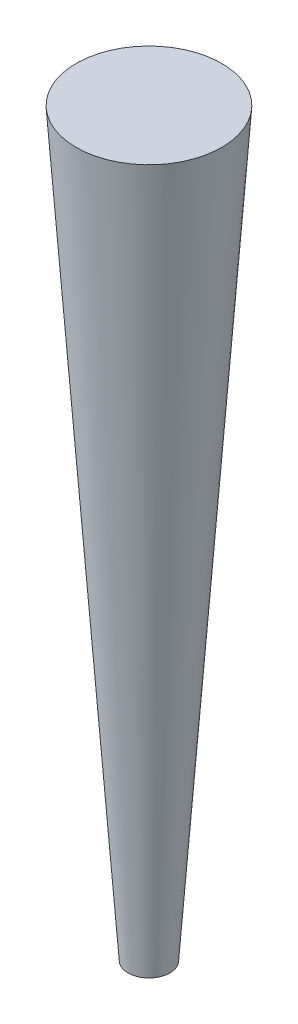
ISO-10303-21;
HEADER;
FILE_DESCRIPTION(('STEP AP214'),'2;1');
FILE_NAME('part.step','',(''),(''),'','','');
FILE_SCHEMA(('AUTOMOTIVE_DESIGN { 1 0 10303 214 1 1 1 1 }'));
ENDSEC;
DATA;
#1=APPLICATION_CONTEXT('core data for automotive mechanical design processes');
#2=APPLICATION_PROTOCOL_DEFINITION('international standard','automotive_design',2000,#1);
#3=PRODUCT_CONTEXT('',#1,'mechanical');
#4=PRODUCT('Part','Part','',(#3));
#5=PRODUCT_RELATED_PRODUCT_CATEGORY('part','',(#4));
#6=PRODUCT_DEFINITION_FORMATION('','',#4);
#7=PRODUCT_DEFINITION_CONTEXT('part definition',#1,'design');
#8=PRODUCT_DEFINITION('design','',#6,#7);
#9=PRODUCT_DEFINITION_SHAPE('','',#8);
#10=(LENGTH_UNIT() NAMED_UNIT(*) SI_UNIT(.MILLI.,.METRE.));
#11=(NAMED_UNIT(*) PLANE_ANGLE_UNIT() SI_UNIT($,.RADIAN.));
#12=(NAMED_UNIT(*) SI_UNIT($,.STERADIAN.) SOLID_ANGLE_UNIT());
#13=UNCERTAINTY_MEASURE_WITH_UNIT(LENGTH_MEASURE(1.E-05),#10,'distance_accuracy_value','');
#14=(GEOMETRIC_REPRESENTATION_CONTEXT(3) GLOBAL_UNCERTAINTY_ASSIGNED_CONTEXT((#13)) GLOBAL_UNIT_ASSIGNED_CONTEXT((#10,
#11,#12)) REPRESENTATION_CONTEXT('',''));
#15=CARTESIAN_POINT('',(0.,0.,0.));
#16=DIRECTION('',(0.,0.,1.));
#17=DIRECTION('',(1.,0.,0.));
#18=AXIS2_PLACEMENT_3D('',#15,#16,#17);
#19=CARTESIAN_POINT('',(0.,300.,0.));
#20=DIRECTION('',(0.,1.,0.));
#21=DIRECTION('',(0.,0.,1.));
#22=AXIS2_PLACEMENT_3D('',#19,#20,#21);
#23=PLANE('',#22);
#24=CARTESIAN_POINT('',(0.,300.,0.));
#25=DIRECTION('',(0.,-1.,0.));
#26=DIRECTION('',(0.,0.,-1.));
#27=AXIS2_PLACEMENT_3D('',#24,#25,#26);
#28=CIRCLE('',#27,28.978043583051);
#29=CARTESIAN_POINT('',(0.,300.,28.978043583051));
#30=VERTEX_POINT('',#29);
#31=EDGE_CURVE('E10',#30,#30,#28,.T.);
#32=ORIENTED_EDGE('',*,*,#31,.F.);
#33=EDGE_LOOP('',(#32));
#34=FACE_BOUND('',#33,.T.);
#35=ADVANCED_FACE('F33',(#34),#23,.T.);
#36=CARTESIAN_POINT('',(0.,0.,0.));
#37=DIRECTION('',(0.,1.,0.));
#38=DIRECTION('',(0.,0.,1.));
#39=AXIS2_PLACEMENT_3D('',#36,#37,#38);
#40=CONICAL_SURFACE('',#39,8.,0.069813170079766);
#41=CARTESIAN_POINT('',(0.,4.97503205442649,0.));
#42=DIRECTION('',(0.,1.,0.));
#43=DIRECTION('',(0.,0.,1.));
#44=AXIS2_PLACEMENT_3D('',#41,#42,#43);
#45=CIRCLE('',#44,8.34788813088278);
#46=CARTESIAN_POINT('',(0.,4.97503205442649,8.34788813088278));
#47=VERTEX_POINT('',#46);
#48=EDGE_CURVE('E36',#47,#47,#45,.F.);
#49=CARTESIAN_POINT('',(0.,4.97503205442649,8.34788813088278));
#50=CARTESIAN_POINT('',(0.,8.04820880385955,8.56278558350953));
#51=CARTESIAN_POINT('',(0.,11.1213855532926,8.77768303613629));
#52=CARTESIAN_POINT('',(0.,17.2677390521587,9.20747794138979));
#53=CARTESIAN_POINT('',(0.,20.3409158015918,9.42237539401654));
#54=CARTESIAN_POINT('',(0.,26.4872693004579,9.85217029927004));
#55=CARTESIAN_POINT('',(0.,29.560446049891,10.0670677518968));
#56=CARTESIAN_POINT('',(0.,35.7067995487571,10.4968626571503));
#57=CARTESIAN_POINT('',(0.,38.7799762981901,10.7117601097771));
#58=CARTESIAN_POINT('',(0.,44.9263297970562,11.1415550150306));
#59=CARTESIAN_POINT('',(0.,47.9995065464893,11.3564524676573));
#60=CARTESIAN_POINT('',(0.,54.1458600453554,11.7862473729108));
#61=CARTESIAN_POINT('',(0.,57.2190367947885,12.0011448255376));
#62=CARTESIAN_POINT('',(0.,63.3653902936546,12.4309397307911));
#63=CARTESIAN_POINT('',(0.,66.4385670430876,12.6458371834178));
#64=CARTESIAN_POINT('',(0.,72.5849205419537,13.0756320886713));
#65=CARTESIAN_POINT('',(0.,75.6580972913868,13.2905295412981));
#66=CARTESIAN_POINT('',(0.,81.8044507902529,13.7203244465516));
#67=CARTESIAN_POINT('',(0.,84.877627539686,13.9352218991783));
#68=CARTESIAN_POINT('',(0.,91.0239810385521,14.3650168044318));
#69=CARTESIAN_POINT('',(0.,94.0971577879852,14.5799142570586));
#70=CARTESIAN_POINT('',(0.,100.243511286851,15.0097091623121));
#71=CARTESIAN_POINT('',(0.,103.316688036284,15.2246066149388));
#72=CARTESIAN_POINT('',(0.,109.46304153515,15.6544015201923));
#73=CARTESIAN_POINT('',(0.,112.536218284583,15.8692989728191));
#74=CARTESIAN_POINT('',(0.,118.68257178345,16.2990938780726));
#75=CARTESIAN_POINT('',(0.,121.755748532883,16.5139913306994));
#76=CARTESIAN_POINT('',(0.,127.902102031749,16.9437862359529));
#77=CARTESIAN_POINT('',(0.,130.975278781182,17.1586836885796));
#78=CARTESIAN_POINT('',(0.,137.121632280048,17.5884785938331));
#79=CARTESIAN_POINT('',(0.,140.194809029481,17.8033760464599));
#80=CARTESIAN_POINT('',(0.,146.341162528347,18.2331709517134));
#81=CARTESIAN_POINT('',(0.,149.41433927778,18.4480684043401));
#82=CARTESIAN_POINT('',(0.,155.560692776646,18.8778633095936));
#83=CARTESIAN_POINT('',(0.,158.633869526079,19.0927607622204));
#84=CARTESIAN_POINT('',(0.,164.780223024945,19.5225556674739));
#85=CARTESIAN_POINT('',(0.,167.853399774379,19.7374531201006));
#86=CARTESIAN_POINT('',(0.,173.999753273245,20.1672480253541));
#87=CARTESIAN_POINT('',(0.,177.072930022678,20.3821454779809));
#88=CARTESIAN_POINT('',(0.,183.219283521544,20.8119403832344));
#89=CARTESIAN_POINT('',(0.,186.292460270977,21.0268378358611));
#90=CARTESIAN_POINT('',(0.,192.438813769843,21.4566327411146));
#91=CARTESIAN_POINT('',(0.,195.511990519276,21.6715301937414));
#92=CARTESIAN_POINT('',(0.,201.658344018142,22.1013250989949));
#93=CARTESIAN_POINT('',(0.,204.731520767575,22.3162225516217));
#94=CARTESIAN_POINT('',(0.,210.877874266441,22.7460174568752));
#95=CARTESIAN_POINT('',(0.,213.951051015874,22.9609149095019));
#96=CARTESIAN_POINT('',(0.,220.097404514741,23.3907098147554));
#97=CARTESIAN_POINT('',(0.,223.170581264174,23.6056072673822));
#98=CARTESIAN_POINT('',(0.,229.31693476304,24.0354021726357));
#99=CARTESIAN_POINT('',(0.,232.390111512473,24.2502996252624));
#100=CARTESIAN_POINT('',(0.,238.536465011339,24.6800945305159));
#101=CARTESIAN_POINT('',(0.,241.609641760772,24.8949919831427));
#102=CARTESIAN_POINT('',(0.,247.755995259638,25.3247868883962));
#103=CARTESIAN_POINT('',(0.,250.829172009071,25.5396843410229));
#104=CARTESIAN_POINT('',(0.,256.975525507937,25.9694792462764));
#105=CARTESIAN_POINT('',(0.,260.04870225737,26.1843766989032));
#106=CARTESIAN_POINT('',(0.,266.195055756236,26.6141716041567));
#107=CARTESIAN_POINT('',(0.,269.268232505669,26.8290690567834));
#108=CARTESIAN_POINT('',(0.,275.414586004536,27.258863962037));
#109=CARTESIAN_POINT('',(0.,278.487762753969,27.4737614146637));
#110=CARTESIAN_POINT('',(0.,284.634116252835,27.9035563199172));
#111=CARTESIAN_POINT('',(0.,287.707293002268,28.118453772544));
#112=CARTESIAN_POINT('',(0.,293.853646501134,28.5482486777975));
#113=CARTESIAN_POINT('',(0.,296.926823250567,28.7631461304242));
#114=CARTESIAN_POINT('',(0.,300.,28.978043583051));
#115=B_SPLINE_CURVE_WITH_KNOTS('',3,(#49,#50,#51,#52,#53,#54,#55,#56,#57,#58,#59,#60,#61,#62,
#63,#64,#65,#66,#67,#68,#69,#70,#71,#72,#73,#74,#75,#76,#77,#78,#79,#80,#81,#82,#83,#84,#85,#86,
#87,#88,#89,#90,#91,#92,#93,#94,#95,#96,#97,#98,#99,#100,#101,#102,#103,#104,#105,#106,#107,
#108,#109,#110,#111,#112,#113,#114),.UNSPECIFIED.,.F.,.F.,(4,2,2,2,2,2,2,2,2,2,2,2,2,2,2,2,2,2,
2,2,2,2,2,2,2,2,2,2,2,2,2,2,4),(0.,9.2420434015218,18.4840868030436,27.7261302045654,
36.9681736060872,46.210217007609,55.4522604091308,64.6943038106526,73.9363472121744,
83.1783906136962,92.420434015218,101.66247741674,110.904520818262,120.146564219783,
129.388607621305,138.630651022827,147.872694424349,157.114737825871,166.356781227392,
175.598824628914,184.840868030436,194.082911431958,203.32495483348,212.566998235001,
221.809041636523,231.051085038045,240.293128439567,249.535171841089,258.77721524261,
268.019258644132,277.261302045654,286.503345447176,295.745388848698),.UNSPECIFIED.);
#116=EDGE_CURVE('BSEAM47',#47,#30,#115,.T.);
#117=ORIENTED_EDGE('',*,*,#48,.F.);
#118=ORIENTED_EDGE('',*,*,#31,.T.);
#119=ORIENTED_EDGE('',*,*,#116,.T.);
#120=ORIENTED_EDGE('',*,*,#116,.F.);
#121=EDGE_LOOP('',(#117,#119,#118,#120));
#122=FACE_BOUND('',#121,.T.);
#123=ADVANCED_FACE('F47',(#122),#40,.T.);
#124=CARTESIAN_POINT('',(-16.3664170235548,4.97503205442649,-28.978043583051));
#125=DIRECTION('',(0.,1.,0.));
#126=DIRECTION('',(0.,0.,1.));
#127=AXIS2_PLACEMENT_3D('',#124,#125,#126);
#128=PLANE('',#127);
#129=ORIENTED_EDGE('',*,*,#48,.T.);
#130=EDGE_LOOP('',(#129));
#131=FACE_BOUND('',#130,.T.);
#132=ADVANCED_FACE('F45',(#131),#128,.F.);
#133=CLOSED_SHELL('',(#35,#123,#132));
#134=MANIFOLD_SOLID_BREP('B2',#133);
#135=ADVANCED_BREP_SHAPE_REPRESENTATION('',(#18,#134),#14);
#136=SHAPE_DEFINITION_REPRESENTATION(#9,#135);
ENDSEC;
END-ISO-10303-21;
